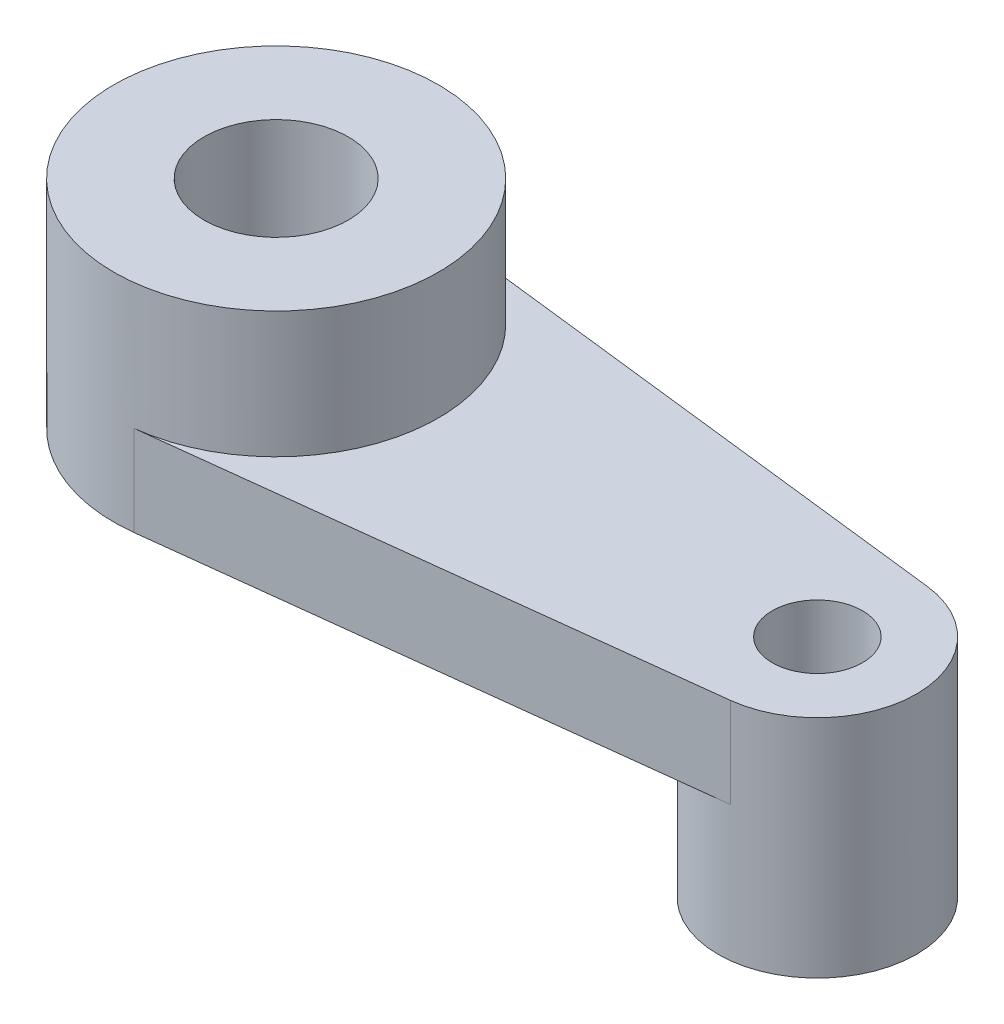
ISO-10303-21;
HEADER;
FILE_DESCRIPTION(('STEP AP214'),'2;1');
FILE_NAME('part.step','',(''),(''),'','','');
FILE_SCHEMA(('AUTOMOTIVE_DESIGN { 1 0 10303 214 1 1 1 1 }'));
ENDSEC;
DATA;
#1=APPLICATION_CONTEXT('core data for automotive mechanical design processes');
#2=APPLICATION_PROTOCOL_DEFINITION('international standard','automotive_design',2000,#1);
#3=PRODUCT_CONTEXT('',#1,'mechanical');
#4=PRODUCT('Part','Part','',(#3));
#5=PRODUCT_RELATED_PRODUCT_CATEGORY('part','',(#4));
#6=PRODUCT_DEFINITION_FORMATION('','',#4);
#7=PRODUCT_DEFINITION_CONTEXT('part definition',#1,'design');
#8=PRODUCT_DEFINITION('design','',#6,#7);
#9=PRODUCT_DEFINITION_SHAPE('','',#8);
#10=(LENGTH_UNIT() NAMED_UNIT(*) SI_UNIT(.MILLI.,.METRE.));
#11=(NAMED_UNIT(*) PLANE_ANGLE_UNIT() SI_UNIT($,.RADIAN.));
#12=(NAMED_UNIT(*) SI_UNIT($,.STERADIAN.) SOLID_ANGLE_UNIT());
#13=UNCERTAINTY_MEASURE_WITH_UNIT(LENGTH_MEASURE(1.E-05),#10,'distance_accuracy_value','');
#14=(GEOMETRIC_REPRESENTATION_CONTEXT(3) GLOBAL_UNCERTAINTY_ASSIGNED_CONTEXT((#13)) GLOBAL_UNIT_ASSIGNED_CONTEXT((#10,
#11,#12)) REPRESENTATION_CONTEXT('',''));
#15=CARTESIAN_POINT('',(0.,0.,0.));
#16=DIRECTION('',(0.,0.,1.));
#17=DIRECTION('',(1.,0.,0.));
#18=AXIS2_PLACEMENT_3D('',#15,#16,#17);
#19=CARTESIAN_POINT('',(0.,24.,0.));
#20=DIRECTION('',(0.,-1.,0.));
#21=DIRECTION('',(0.,0.,-1.));
#22=AXIS2_PLACEMENT_3D('',#19,#20,#21);
#23=CYLINDRICAL_SURFACE('',#22,18.);
#24=CARTESIAN_POINT('',(0.,24.,0.));
#25=DIRECTION('',(0.,1.,0.));
#26=DIRECTION('',(0.,0.,1.));
#27=AXIS2_PLACEMENT_3D('',#24,#25,#26);
#28=CIRCLE('',#27,18.);
#29=CARTESIAN_POINT('',(0.,24.,18.));
#30=VERTEX_POINT('',#29);
#31=EDGE_CURVE('E134',#30,#30,#28,.T.);
#32=ORIENTED_EDGE('',*,*,#31,.F.);
#33=EDGE_LOOP('',(#32));
#34=FACE_BOUND('',#33,.T.);
#35=CARTESIAN_POINT('',(0.,10.,0.));
#36=DIRECTION('',(0.,-1.,0.));
#37=DIRECTION('',(0.,0.,-1.));
#38=AXIS2_PLACEMENT_3D('',#35,#36,#37);
#39=CIRCLE('',#38,18.);
#40=CARTESIAN_POINT('',(2.1,10.,-17.8770802985275));
#41=VERTEX_POINT('',#40);
#42=CARTESIAN_POINT('',(2.1,10.,17.8770802985275));
#43=VERTEX_POINT('',#42);
#44=EDGE_CURVE('E61',#41,#43,#39,.T.);
#45=ORIENTED_EDGE('',*,*,#44,.F.);
#46=DIRECTION('',(0.,-1.,0.));
#47=VECTOR('',#46,1.);
#48=CARTESIAN_POINT('',(2.1,10.,-17.8770802985275));
#49=LINE('',#48,#47);
#50=CARTESIAN_POINT('',(2.1,0.,-17.8770802985275));
#51=VERTEX_POINT('',#50);
#52=EDGE_CURVE('E111',#41,#51,#49,.T.);
#53=ORIENTED_EDGE('',*,*,#52,.T.);
#54=CARTESIAN_POINT('',(0.,0.,0.));
#55=DIRECTION('',(0.,1.,0.));
#56=DIRECTION('',(0.,0.,1.));
#57=AXIS2_PLACEMENT_3D('',#54,#55,#56);
#58=CIRCLE('',#57,18.);
#59=CARTESIAN_POINT('',(2.1,0.,17.8770802985275));
#60=VERTEX_POINT('',#59);
#61=EDGE_CURVE('E114',#51,#60,#58,.T.);
#62=ORIENTED_EDGE('',*,*,#61,.T.);
#63=DIRECTION('',(0.,-1.,0.));
#64=VECTOR('',#63,1.);
#65=CARTESIAN_POINT('',(2.1,10.,17.8770802985275));
#66=LINE('',#65,#64);
#67=EDGE_CURVE('E73',#43,#60,#66,.T.);
#68=ORIENTED_EDGE('',*,*,#67,.F.);
#69=EDGE_LOOP('',(#45,#53,#62,#68));
#70=FACE_BOUND('',#69,.T.);
#71=ADVANCED_FACE('F51',(#34,#70),#23,.T.);
#72=CARTESIAN_POINT('',(0.,24.,0.));
#73=DIRECTION('',(0.,1.,0.));
#74=DIRECTION('',(0.,0.,1.));
#75=AXIS2_PLACEMENT_3D('',#72,#73,#74);
#76=PLANE('',#75);
#77=CARTESIAN_POINT('',(0.,24.,0.));
#78=DIRECTION('',(0.,1.,0.));
#79=DIRECTION('',(0.,0.,1.));
#80=AXIS2_PLACEMENT_3D('',#77,#78,#79);
#81=CIRCLE('',#80,8.);
#82=CARTESIAN_POINT('',(0.,24.,8.));
#83=VERTEX_POINT('',#82);
#84=EDGE_CURVE('E152',#83,#83,#81,.T.);
#85=ORIENTED_EDGE('',*,*,#84,.F.);
#86=EDGE_LOOP('',(#85));
#87=FACE_BOUND('',#86,.T.);
#88=ORIENTED_EDGE('',*,*,#31,.T.);
#89=EDGE_LOOP('',(#88));
#90=FACE_BOUND('',#89,.T.);
#91=ADVANCED_FACE('F180',(#87,#90),#76,.T.);
#92=CARTESIAN_POINT('',(0.,0.,0.));
#93=DIRECTION('',(0.,1.,0.));
#94=DIRECTION('',(0.,0.,1.));
#95=AXIS2_PLACEMENT_3D('',#92,#93,#94);
#96=PLANE('',#95);
#97=CARTESIAN_POINT('',(0.,0.,0.));
#98=DIRECTION('',(0.,1.,0.));
#99=DIRECTION('',(0.,0.,1.));
#100=AXIS2_PLACEMENT_3D('',#97,#98,#99);
#101=CIRCLE('',#100,8.);
#102=CARTESIAN_POINT('',(0.,0.,8.));
#103=VERTEX_POINT('',#102);
#104=EDGE_CURVE('E55',#103,#103,#101,.T.);
#105=ORIENTED_EDGE('',*,*,#104,.T.);
#106=EDGE_LOOP('',(#105));
#107=FACE_BOUND('',#106,.T.);
#108=DIRECTION('',(-0.993171127695972,0.,-0.116666666666667));
#109=VECTOR('',#108,1.);
#110=CARTESIAN_POINT('',(2.1,0.,-17.8770802985275));
#111=LINE('',#110,#109);
#112=CARTESIAN_POINT('',(61.2833333333333,0.,-10.9248824046557));
#113=VERTEX_POINT('',#112);
#114=EDGE_CURVE('E108',#113,#51,#111,.T.);
#115=ORIENTED_EDGE('',*,*,#114,.F.);
#116=CARTESIAN_POINT('',(60.,0.,0.));
#117=DIRECTION('',(0.,1.,0.));
#118=DIRECTION('',(0.,0.,1.));
#119=AXIS2_PLACEMENT_3D('',#116,#117,#118);
#120=CIRCLE('',#119,11.);
#121=CARTESIAN_POINT('',(61.2833333333333,0.,10.9248824046557));
#122=VERTEX_POINT('',#121);
#123=EDGE_CURVE('E11',#113,#122,#120,.T.);
#124=ORIENTED_EDGE('',*,*,#123,.T.);
#125=DIRECTION('',(0.993171127695972,0.,-0.116666666666667));
#126=VECTOR('',#125,1.);
#127=CARTESIAN_POINT('',(61.2833333333333,0.,10.9248824046557));
#128=LINE('',#127,#126);
#129=EDGE_CURVE('E117',#60,#122,#128,.T.);
#130=ORIENTED_EDGE('',*,*,#129,.F.);
#131=ORIENTED_EDGE('',*,*,#61,.F.);
#132=EDGE_LOOP('',(#115,#124,#130,#131));
#133=FACE_BOUND('',#132,.T.);
#134=ADVANCED_FACE('F113',(#107,#133),#96,.F.);
#135=CARTESIAN_POINT('',(0.,10.,0.));
#136=DIRECTION('',(0.,-1.,0.));
#137=DIRECTION('',(0.,0.,-1.));
#138=AXIS2_PLACEMENT_3D('',#135,#136,#137);
#139=PLANE('',#138);
#140=CARTESIAN_POINT('',(60.,10.,0.));
#141=DIRECTION('',(0.,-1.,0.));
#142=DIRECTION('',(0.,0.,-1.));
#143=AXIS2_PLACEMENT_3D('',#140,#141,#142);
#144=CIRCLE('',#143,5.);
#145=CARTESIAN_POINT('',(60.,10.,-5.));
#146=VERTEX_POINT('',#145);
#147=EDGE_CURVE('E156',#146,#146,#144,.F.);
#148=ORIENTED_EDGE('',*,*,#147,.F.);
#149=EDGE_LOOP('',(#148));
#150=FACE_BOUND('',#149,.T.);
#151=DIRECTION('',(-0.993171127695972,0.,-0.116666666666667));
#152=VECTOR('',#151,1.);
#153=CARTESIAN_POINT('',(2.1,10.,-17.8770802985275));
#154=LINE('',#153,#152);
#155=CARTESIAN_POINT('',(61.2833333333333,10.,-10.9248824046557));
#156=VERTEX_POINT('',#155);
#157=EDGE_CURVE('E109',#156,#41,#154,.T.);
#158=ORIENTED_EDGE('',*,*,#157,.T.);
#159=ORIENTED_EDGE('',*,*,#44,.T.);
#160=DIRECTION('',(0.993171127695972,0.,-0.116666666666667));
#161=VECTOR('',#160,1.);
#162=CARTESIAN_POINT('',(61.2833333333333,10.,10.9248824046557));
#163=LINE('',#162,#161);
#164=CARTESIAN_POINT('',(61.2833333333333,10.,10.9248824046557));
#165=VERTEX_POINT('',#164);
#166=EDGE_CURVE('E116',#43,#165,#163,.T.);
#167=ORIENTED_EDGE('',*,*,#166,.T.);
#168=CARTESIAN_POINT('',(60.,10.,0.));
#169=DIRECTION('',(0.,1.,0.));
#170=DIRECTION('',(0.,0.,-1.));
#171=AXIS2_PLACEMENT_3D('',#168,#169,#170);
#172=CIRCLE('',#171,11.);
#173=EDGE_CURVE('E121',#165,#156,#172,.T.);
#174=ORIENTED_EDGE('',*,*,#173,.T.);
#175=EDGE_LOOP('',(#158,#159,#167,#174));
#176=FACE_BOUND('',#175,.T.);
#177=ADVANCED_FACE('F142',(#150,#176),#139,.F.);
#178=CARTESIAN_POINT('',(61.2833333333333,10.,10.9248824046557));
#179=DIRECTION('',(-0.116666666666667,0.,-0.993171127695972));
#180=DIRECTION('',(-0.993171127695972,0.,0.116666666666667));
#181=AXIS2_PLACEMENT_3D('',#178,#179,#180);
#182=PLANE('',#181);
#183=ORIENTED_EDGE('',*,*,#129,.T.);
#184=DIRECTION('',(0.,-1.,0.));
#185=VECTOR('',#184,1.);
#186=CARTESIAN_POINT('',(61.2833333333333,10.,10.9248824046557));
#187=LINE('',#186,#185);
#188=EDGE_CURVE('E99',#165,#122,#187,.T.);
#189=ORIENTED_EDGE('',*,*,#188,.F.);
#190=ORIENTED_EDGE('',*,*,#166,.F.);
#191=ORIENTED_EDGE('',*,*,#67,.T.);
#192=EDGE_LOOP('',(#183,#189,#190,#191));
#193=FACE_BOUND('',#192,.T.);
#194=ADVANCED_FACE('F144',(#193),#182,.F.);
#195=CARTESIAN_POINT('',(60.,10.,0.));
#196=DIRECTION('',(0.,-1.,0.));
#197=DIRECTION('',(0.,0.,-1.));
#198=AXIS2_PLACEMENT_3D('',#195,#196,#197);
#199=CYLINDRICAL_SURFACE('',#198,11.);
#200=ORIENTED_EDGE('',*,*,#188,.T.);
#201=ORIENTED_EDGE('',*,*,#123,.F.);
#202=DIRECTION('',(0.,-1.,0.));
#203=VECTOR('',#202,1.);
#204=CARTESIAN_POINT('',(61.2833333333333,10.,-10.9248824046557));
#205=LINE('',#204,#203);
#206=EDGE_CURVE('E96',#156,#113,#205,.T.);
#207=ORIENTED_EDGE('',*,*,#206,.F.);
#208=ORIENTED_EDGE('',*,*,#173,.F.);
#209=EDGE_LOOP('',(#200,#201,#207,#208));
#210=FACE_BOUND('',#209,.T.);
#211=CARTESIAN_POINT('',(60.,-15.,0.));
#212=DIRECTION('',(0.,1.,0.));
#213=DIRECTION('',(0.,0.,1.));
#214=AXIS2_PLACEMENT_3D('',#211,#212,#213);
#215=CIRCLE('',#214,11.);
#216=CARTESIAN_POINT('',(60.,-15.,11.));
#217=VERTEX_POINT('',#216);
#218=EDGE_CURVE('E124',#217,#217,#215,.T.);
#219=ORIENTED_EDGE('',*,*,#218,.T.);
#220=EDGE_LOOP('',(#219));
#221=FACE_BOUND('',#220,.T.);
#222=ADVANCED_FACE('F93',(#210,#221),#199,.T.);
#223=CARTESIAN_POINT('',(2.1,10.,-17.8770802985275));
#224=DIRECTION('',(-0.116666666666667,0.,0.993171127695972));
#225=DIRECTION('',(0.993171127695972,0.,0.116666666666667));
#226=AXIS2_PLACEMENT_3D('',#223,#224,#225);
#227=PLANE('',#226);
#228=ORIENTED_EDGE('',*,*,#114,.T.);
#229=ORIENTED_EDGE('',*,*,#52,.F.);
#230=ORIENTED_EDGE('',*,*,#157,.F.);
#231=ORIENTED_EDGE('',*,*,#206,.T.);
#232=EDGE_LOOP('',(#228,#229,#230,#231));
#233=FACE_BOUND('',#232,.T.);
#234=ADVANCED_FACE('F106',(#233),#227,.F.);
#235=CARTESIAN_POINT('',(60.,-15.,0.));
#236=DIRECTION('',(0.,1.,0.));
#237=DIRECTION('',(0.,0.,1.));
#238=AXIS2_PLACEMENT_3D('',#235,#236,#237);
#239=PLANE('',#238);
#240=CARTESIAN_POINT('',(60.,-15.,0.));
#241=DIRECTION('',(0.,1.,0.));
#242=DIRECTION('',(0.,0.,1.));
#243=AXIS2_PLACEMENT_3D('',#240,#241,#242);
#244=CIRCLE('',#243,5.);
#245=CARTESIAN_POINT('',(60.,-15.,5.));
#246=VERTEX_POINT('',#245);
#247=EDGE_CURVE('E160',#246,#246,#244,.T.);
#248=ORIENTED_EDGE('',*,*,#247,.T.);
#249=EDGE_LOOP('',(#248));
#250=FACE_BOUND('',#249,.T.);
#251=ORIENTED_EDGE('',*,*,#218,.F.);
#252=EDGE_LOOP('',(#251));
#253=FACE_BOUND('',#252,.T.);
#254=ADVANCED_FACE('F164',(#250,#253),#239,.F.);
#255=CARTESIAN_POINT('',(0.,-15.,0.));
#256=DIRECTION('',(0.,1.,0.));
#257=DIRECTION('',(0.,0.,1.));
#258=AXIS2_PLACEMENT_3D('',#255,#256,#257);
#259=CYLINDRICAL_SURFACE('',#258,8.);
#260=ORIENTED_EDGE('',*,*,#84,.T.);
#261=EDGE_LOOP('',(#260));
#262=FACE_BOUND('',#261,.T.);
#263=ORIENTED_EDGE('',*,*,#104,.F.);
#264=EDGE_LOOP('',(#263));
#265=FACE_BOUND('',#264,.T.);
#266=ADVANCED_FACE('F170',(#262,#265),#259,.F.);
#267=CARTESIAN_POINT('',(60.,24.,0.));
#268=DIRECTION('',(0.,-1.,0.));
#269=DIRECTION('',(0.,0.,-1.));
#270=AXIS2_PLACEMENT_3D('',#267,#268,#269);
#271=CYLINDRICAL_SURFACE('',#270,5.);
#272=ORIENTED_EDGE('',*,*,#247,.F.);
#273=EDGE_LOOP('',(#272));
#274=FACE_BOUND('',#273,.T.);
#275=ORIENTED_EDGE('',*,*,#147,.T.);
#276=EDGE_LOOP('',(#275));
#277=FACE_BOUND('',#276,.T.);
#278=ADVANCED_FACE('F167',(#274,#277),#271,.F.);
#279=CLOSED_SHELL('',(#71,#91,#134,#177,#194,#222,#234,#254,#266,#278));
#280=MANIFOLD_SOLID_BREP('B2',#279);
#281=ADVANCED_BREP_SHAPE_REPRESENTATION('',(#18,#280),#14);
#282=SHAPE_DEFINITION_REPRESENTATION(#9,#281);
ENDSEC;
END-ISO-10303-21;
